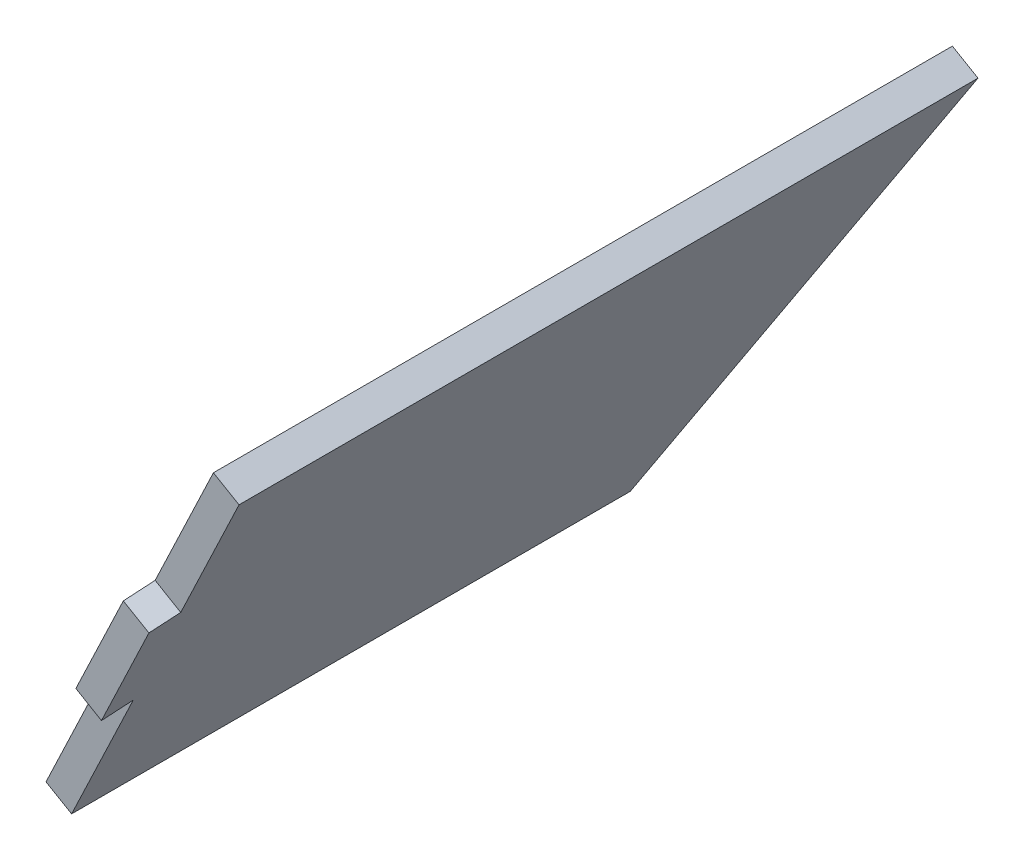
ISO-10303-21;
HEADER;
FILE_DESCRIPTION(('STEP AP214'),'2;1');
FILE_NAME('part.step','',(''),(''),'','','');
FILE_SCHEMA(('AUTOMOTIVE_DESIGN { 1 0 10303 214 1 1 1 1 }'));
ENDSEC;
DATA;
#1=APPLICATION_CONTEXT('core data for automotive mechanical design processes');
#2=APPLICATION_PROTOCOL_DEFINITION('international standard','automotive_design',2000,#1);
#3=PRODUCT_CONTEXT('',#1,'mechanical');
#4=PRODUCT('Part','Part','',(#3));
#5=PRODUCT_RELATED_PRODUCT_CATEGORY('part','',(#4));
#6=PRODUCT_DEFINITION_FORMATION('','',#4);
#7=PRODUCT_DEFINITION_CONTEXT('part definition',#1,'design');
#8=PRODUCT_DEFINITION('design','',#6,#7);
#9=PRODUCT_DEFINITION_SHAPE('','',#8);
#10=(LENGTH_UNIT() NAMED_UNIT(*) SI_UNIT(.MILLI.,.METRE.));
#11=(NAMED_UNIT(*) PLANE_ANGLE_UNIT() SI_UNIT($,.RADIAN.));
#12=(NAMED_UNIT(*) SI_UNIT($,.STERADIAN.) SOLID_ANGLE_UNIT());
#13=UNCERTAINTY_MEASURE_WITH_UNIT(LENGTH_MEASURE(1.E-05),#10,'distance_accuracy_value','');
#14=(GEOMETRIC_REPRESENTATION_CONTEXT(3) GLOBAL_UNCERTAINTY_ASSIGNED_CONTEXT((#13)) GLOBAL_UNIT_ASSIGNED_CONTEXT((#10,
#11,#12)) REPRESENTATION_CONTEXT('',''));
#15=CARTESIAN_POINT('',(0.,0.,0.));
#16=DIRECTION('',(0.,0.,1.));
#17=DIRECTION('',(1.,0.,0.));
#18=AXIS2_PLACEMENT_3D('',#15,#16,#17);
#19=CARTESIAN_POINT('',(-655.979093207312,-85.2202453071139,0.));
#20=DIRECTION('',(-0.503871025524086,-0.863778900898433,0.));
#21=DIRECTION('',(0.863778900898433,-0.503871025524086,0.));
#22=AXIS2_PLACEMENT_3D('',#19,#20,#21);
#23=PLANE('',#22);
#24=DIRECTION('',(0.,0.,1.));
#25=VECTOR('',#24,1.);
#26=CARTESIAN_POINT('',(-660.4,-82.6413830113791,0.));
#27=LINE('',#26,#25);
#28=CARTESIAN_POINT('',(-660.4,-82.6413830113788,-50.8));
#29=VERTEX_POINT('',#28);
#30=CARTESIAN_POINT('',(-660.4,-82.6413830113791,45.6029202790707));
#31=VERTEX_POINT('',#30);
#32=EDGE_CURVE('E131',#29,#31,#27,.T.);
#33=ORIENTED_EDGE('',*,*,#32,.F.);
#34=DIRECTION('',(-0.863778900898433,0.503871025524086,0.));
#35=VECTOR('',#34,1.);
#36=CARTESIAN_POINT('',(-655.979093207312,-85.2202453071136,-50.8));
#37=LINE('',#36,#35);
#38=CARTESIAN_POINT('',(-655.979093207312,-85.2202453071136,-50.8));
#39=VERTEX_POINT('',#38);
#40=EDGE_CURVE('E11',#39,#29,#37,.T.);
#41=ORIENTED_EDGE('',*,*,#40,.F.);
#42=DIRECTION('',(0.,0.,1.));
#43=VECTOR('',#42,1.);
#44=CARTESIAN_POINT('',(-655.979093207312,-85.2202453071139,0.));
#45=LINE('',#44,#43);
#46=CARTESIAN_POINT('',(-655.979093207312,-85.220245307114,45.6029202790707));
#47=VERTEX_POINT('',#46);
#48=EDGE_CURVE('E151',#39,#47,#45,.T.);
#49=ORIENTED_EDGE('',*,*,#48,.T.);
#50=DIRECTION('',(-0.863778900898433,0.503871025524086,0.));
#51=VECTOR('',#50,1.);
#52=CARTESIAN_POINT('',(-655.979093207312,-85.220245307114,45.6029202790707));
#53=LINE('',#52,#51);
#54=EDGE_CURVE('E38',#47,#31,#53,.T.);
#55=ORIENTED_EDGE('',*,*,#54,.T.);
#56=EDGE_LOOP('',(#33,#41,#49,#55));
#57=FACE_BOUND('',#56,.T.);
#58=ADVANCED_FACE('F35',(#57),#23,.T.);
#59=CARTESIAN_POINT('',(-462.864654077372,245.83307891564,-118.390053695479));
#60=DIRECTION('',(-0.0875097017545337,-0.150016631579201,-0.984803057645773));
#61=DIRECTION('',(0.,0.988595639399345,-0.150594361649434));
#62=AXIS2_PLACEMENT_3D('',#59,#60,#61);
#63=PLANE('',#62);
#64=DIRECTION('',(-0.496213726595231,-0.850652102734682,0.173674804308331));
#65=VECTOR('',#64,1.);
#66=CARTESIAN_POINT('',(-467.28556087006,248.411941211375,-118.390053695479));
#67=LINE('',#66,#65);
#68=CARTESIAN_POINT('',(-615.95,-6.44138301137923,-66.3574999999999));
#69=VERTEX_POINT('',#68);
#70=EDGE_CURVE('E149',#69,#29,#67,.T.);
#71=ORIENTED_EDGE('',*,*,#70,.F.);
#72=DIRECTION('',(-0.863778900898433,0.503871025524086,0.));
#73=VECTOR('',#72,1.);
#74=CARTESIAN_POINT('',(-611.529093207312,-9.02024530711405,-66.3574999999999));
#75=LINE('',#74,#73);
#76=CARTESIAN_POINT('',(-611.529093207312,-9.02024530711405,-66.3574999999999));
#77=VERTEX_POINT('',#76);
#78=EDGE_CURVE('E44',#77,#69,#75,.T.);
#79=ORIENTED_EDGE('',*,*,#78,.F.);
#80=DIRECTION('',(-0.496213726595231,-0.850652102734682,0.173674804308331));
#81=VECTOR('',#80,1.);
#82=CARTESIAN_POINT('',(-462.864654077372,245.83307891564,-118.390053695479));
#83=LINE('',#82,#81);
#84=EDGE_CURVE('E120',#77,#39,#83,.T.);
#85=ORIENTED_EDGE('',*,*,#84,.T.);
#86=ORIENTED_EDGE('',*,*,#40,.T.);
#87=EDGE_LOOP('',(#71,#79,#85,#86));
#88=FACE_BOUND('',#87,.T.);
#89=ADVANCED_FACE('F163',(#88),#63,.T.);
#90=CARTESIAN_POINT('',(-611.529093207312,-9.02024530711397,0.));
#91=DIRECTION('',(0.503871025524086,0.863778900898433,0.));
#92=DIRECTION('',(-0.863778900898433,0.503871025524086,0.));
#93=AXIS2_PLACEMENT_3D('',#90,#91,#92);
#94=PLANE('',#93);
#95=DIRECTION('',(0.,0.,-1.));
#96=VECTOR('',#95,1.);
#97=CARTESIAN_POINT('',(-615.95,-6.44138301137914,0.));
#98=LINE('',#97,#96);
#99=CARTESIAN_POINT('',(-615.95,-6.4413830113792,61.1604202790707));
#100=VERTEX_POINT('',#99);
#101=EDGE_CURVE('E109',#100,#69,#98,.T.);
#102=ORIENTED_EDGE('',*,*,#101,.F.);
#103=DIRECTION('',(-0.863778900898433,0.503871025524086,0.));
#104=VECTOR('',#103,1.);
#105=CARTESIAN_POINT('',(-611.529093207312,-9.02024530711402,61.1604202790707));
#106=LINE('',#105,#104);
#107=CARTESIAN_POINT('',(-611.529093207312,-9.02024530711402,61.1604202790707));
#108=VERTEX_POINT('',#107);
#109=EDGE_CURVE('E104',#108,#100,#106,.T.);
#110=ORIENTED_EDGE('',*,*,#109,.F.);
#111=DIRECTION('',(0.,0.,-1.));
#112=VECTOR('',#111,1.);
#113=CARTESIAN_POINT('',(-611.529093207312,-9.02024530711397,0.));
#114=LINE('',#113,#112);
#115=EDGE_CURVE('E107',#108,#77,#114,.T.);
#116=ORIENTED_EDGE('',*,*,#115,.T.);
#117=ORIENTED_EDGE('',*,*,#78,.T.);
#118=EDGE_LOOP('',(#102,#110,#116,#117));
#119=FACE_BOUND('',#118,.T.);
#120=ADVANCED_FACE('F106',(#119),#94,.T.);
#121=CARTESIAN_POINT('',(-462.416770672822,246.600879037726,113.349733166142));
#122=DIRECTION('',(-0.0875097017545336,-0.1500166315792,0.984803057645773));
#123=DIRECTION('',(0.,-0.988595639399345,-0.150594361649434));
#124=AXIS2_PLACEMENT_3D('',#121,#122,#123);
#125=PLANE('',#124);
#126=DIRECTION('',(0.496213726595231,0.850652102734682,0.173674804308331));
#127=VECTOR('',#126,1.);
#128=CARTESIAN_POINT('',(-466.83767746551,249.17974133346,113.349733166142));
#129=LINE('',#128,#127);
#130=CARTESIAN_POINT('',(-631.425202267691,-32.9703011845631,55.744099485379));
#131=VERTEX_POINT('',#130);
#132=EDGE_CURVE('E146',#131,#100,#129,.T.);
#133=ORIENTED_EDGE('',*,*,#132,.F.);
#134=DIRECTION('',(-0.863778900898433,0.503871025524086,0.));
#135=VECTOR('',#134,1.);
#136=CARTESIAN_POINT('',(-627.004295475003,-35.549163480298,55.744099485379));
#137=LINE('',#136,#135);
#138=CARTESIAN_POINT('',(-627.004295475003,-35.549163480298,55.744099485379));
#139=VERTEX_POINT('',#138);
#140=EDGE_CURVE('E114',#139,#131,#137,.T.);
#141=ORIENTED_EDGE('',*,*,#140,.F.);
#142=DIRECTION('',(0.496213726595231,0.850652102734682,0.173674804308331));
#143=VECTOR('',#142,1.);
#144=CARTESIAN_POINT('',(-462.416770672822,246.600879037726,113.349733166142));
#145=LINE('',#144,#143);
#146=EDGE_CURVE('E119',#139,#108,#145,.T.);
#147=ORIENTED_EDGE('',*,*,#146,.T.);
#148=ORIENTED_EDGE('',*,*,#109,.T.);
#149=EDGE_LOOP('',(#133,#141,#147,#148));
#150=FACE_BOUND('',#149,.T.);
#151=ADVANCED_FACE('F122',(#150),#125,.T.);
#152=CARTESIAN_POINT('',(-616.932026439773,-18.2824165627608,-57.6056336807641));
#153=DIRECTION('',(-0.496213726595231,-0.850652102734682,-0.173674804308334));
#154=DIRECTION('',(0.863778900898433,-0.503871025524086,0.));
#155=AXIS2_PLACEMENT_3D('',#152,#153,#154);
#156=PLANE('',#155);
#157=DIRECTION('',(-0.0875097017545352,-0.150016631579203,0.984803057645772));
#158=VECTOR('',#157,1.);
#159=CARTESIAN_POINT('',(-621.352933232461,-15.703554267026,-57.6056336807641));
#160=LINE('',#159,#158);
#161=CARTESIAN_POINT('',(-631.873085672241,-33.7381013066486,60.7844200147158));
#162=VERTEX_POINT('',#161);
#163=EDGE_CURVE('E143',#131,#162,#160,.T.);
#164=ORIENTED_EDGE('',*,*,#163,.T.);
#165=DIRECTION('',(-0.863778900898433,0.503871025524086,0.));
#166=VECTOR('',#165,1.);
#167=CARTESIAN_POINT('',(-627.452178879553,-36.3169636023834,60.7844200147158));
#168=LINE('',#167,#166);
#169=CARTESIAN_POINT('',(-627.452178879553,-36.3169636023834,60.7844200147158));
#170=VERTEX_POINT('',#169);
#171=EDGE_CURVE('E155',#170,#162,#168,.T.);
#172=ORIENTED_EDGE('',*,*,#171,.F.);
#173=DIRECTION('',(-0.0875097017545352,-0.150016631579203,0.984803057645772));
#174=VECTOR('',#173,1.);
#175=CARTESIAN_POINT('',(-616.932026439773,-18.2824165627608,-57.6056336807641));
#176=LINE('',#175,#174);
#177=EDGE_CURVE('E124',#139,#170,#176,.T.);
#178=ORIENTED_EDGE('',*,*,#177,.F.);
#179=ORIENTED_EDGE('',*,*,#140,.T.);
#180=EDGE_LOOP('',(#164,#172,#178,#179));
#181=FACE_BOUND('',#180,.T.);
#182=ADVANCED_FACE('F176',(#181),#156,.F.);
#183=CARTESIAN_POINT('',(-462.864654077372,245.83307891564,118.390053695479));
#184=DIRECTION('',(-0.0875097017545337,-0.150016631579201,0.984803057645773));
#185=DIRECTION('',(0.,-0.988595639399345,-0.150594361649434));
#186=AXIS2_PLACEMENT_3D('',#183,#184,#185);
#187=PLANE('',#186);
#188=DIRECTION('',(0.496213726595231,0.850652102734682,0.173674804308331));
#189=VECTOR('',#188,1.);
#190=CARTESIAN_POINT('',(-467.28556087006,248.411941211375,118.390053695479));
#191=LINE('',#190,#189);
#192=CARTESIAN_POINT('',(-644.47691432776,-55.3446647161094,56.3730799852842));
#193=VERTEX_POINT('',#192);
#194=EDGE_CURVE('E140',#193,#162,#191,.T.);
#195=ORIENTED_EDGE('',*,*,#194,.F.);
#196=DIRECTION('',(-0.863778900898433,0.503871025524086,0.));
#197=VECTOR('',#196,1.);
#198=CARTESIAN_POINT('',(-640.056007535071,-57.9235270118443,56.3730799852842));
#199=LINE('',#198,#197);
#200=CARTESIAN_POINT('',(-640.056007535071,-57.9235270118443,56.3730799852842));
#201=VERTEX_POINT('',#200);
#202=EDGE_CURVE('E157',#201,#193,#199,.T.);
#203=ORIENTED_EDGE('',*,*,#202,.F.);
#204=DIRECTION('',(0.496213726595231,0.850652102734682,0.173674804308331));
#205=VECTOR('',#204,1.);
#206=CARTESIAN_POINT('',(-462.864654077372,245.83307891564,118.390053695479));
#207=LINE('',#206,#205);
#208=EDGE_CURVE('E126',#201,#170,#207,.T.);
#209=ORIENTED_EDGE('',*,*,#208,.T.);
#210=ORIENTED_EDGE('',*,*,#171,.T.);
#211=EDGE_LOOP('',(#195,#203,#209,#210));
#212=FACE_BOUND('',#211,.T.);
#213=ADVANCED_FACE('F179',(#212),#187,.T.);
#214=CARTESIAN_POINT('',(-629.535855095291,-39.8889799722217,-62.0169737101957));
#215=DIRECTION('',(-0.496213726595231,-0.850652102734682,-0.173674804308333));
#216=DIRECTION('',(0.863778900898433,-0.503871025524086,0.));
#217=AXIS2_PLACEMENT_3D('',#214,#215,#216);
#218=PLANE('',#217);
#219=DIRECTION('',(-0.0875097017545351,-0.150016631579203,0.984803057645772));
#220=VECTOR('',#219,1.);
#221=CARTESIAN_POINT('',(-633.95676188798,-37.3101176764869,-62.0169737101957));
#222=LINE('',#221,#220);
#223=CARTESIAN_POINT('',(-644.02903092321,-54.5768645940241,51.3327594559474));
#224=VERTEX_POINT('',#223);
#225=EDGE_CURVE('E137',#224,#193,#222,.T.);
#226=ORIENTED_EDGE('',*,*,#225,.F.);
#227=DIRECTION('',(-0.863778900898433,0.503871025524086,0.));
#228=VECTOR('',#227,1.);
#229=CARTESIAN_POINT('',(-639.608124130522,-57.1557268897589,51.3327594559474));
#230=LINE('',#229,#228);
#231=CARTESIAN_POINT('',(-639.608124130522,-57.1557268897589,51.3327594559474));
#232=VERTEX_POINT('',#231);
#233=EDGE_CURVE('E158',#232,#224,#230,.T.);
#234=ORIENTED_EDGE('',*,*,#233,.F.);
#235=DIRECTION('',(-0.0875097017545351,-0.150016631579203,0.984803057645772));
#236=VECTOR('',#235,1.);
#237=CARTESIAN_POINT('',(-629.535855095291,-39.8889799722217,-62.0169737101957));
#238=LINE('',#237,#236);
#239=EDGE_CURVE('E303',#232,#201,#238,.T.);
#240=ORIENTED_EDGE('',*,*,#239,.T.);
#241=ORIENTED_EDGE('',*,*,#202,.T.);
#242=EDGE_LOOP('',(#226,#234,#240,#241));
#243=FACE_BOUND('',#242,.T.);
#244=ADVANCED_FACE('F183',(#243),#218,.T.);
#245=CARTESIAN_POINT('',(-462.416770672822,246.600879037726,113.349733166142));
#246=DIRECTION('',(-0.0875097017545336,-0.1500166315792,0.984803057645773));
#247=DIRECTION('',(0.,-0.988595639399345,-0.150594361649434));
#248=AXIS2_PLACEMENT_3D('',#245,#246,#247);
#249=PLANE('',#248);
#250=DIRECTION('',(0.496213726595231,0.850652102734682,0.173674804308331));
#251=VECTOR('',#250,1.);
#252=CARTESIAN_POINT('',(-466.83767746551,249.17974133346,113.349733166142));
#253=LINE('',#252,#251);
#254=EDGE_CURVE('E134',#31,#224,#253,.T.);
#255=ORIENTED_EDGE('',*,*,#254,.F.);
#256=ORIENTED_EDGE('',*,*,#54,.F.);
#257=DIRECTION('',(0.496213726595231,0.850652102734682,0.173674804308331));
#258=VECTOR('',#257,1.);
#259=CARTESIAN_POINT('',(-462.416770672822,246.600879037726,113.349733166142));
#260=LINE('',#259,#258);
#261=EDGE_CURVE('E304',#47,#232,#260,.T.);
#262=ORIENTED_EDGE('',*,*,#261,.T.);
#263=ORIENTED_EDGE('',*,*,#233,.T.);
#264=EDGE_LOOP('',(#255,#256,#262,#263));
#265=FACE_BOUND('',#264,.T.);
#266=ADVANCED_FACE('F160',(#265),#249,.T.);
#267=CARTESIAN_POINT('',(-452.344501637592,263.867625955262,0.));
#268=DIRECTION('',(-0.863778900898433,0.503871025524086,0.));
#269=DIRECTION('',(-0.503871025524086,-0.863778900898433,0.));
#270=AXIS2_PLACEMENT_3D('',#267,#268,#269);
#271=PLANE('',#270);
#272=ORIENTED_EDGE('',*,*,#48,.F.);
#273=ORIENTED_EDGE('',*,*,#84,.F.);
#274=ORIENTED_EDGE('',*,*,#115,.F.);
#275=ORIENTED_EDGE('',*,*,#146,.F.);
#276=ORIENTED_EDGE('',*,*,#177,.T.);
#277=ORIENTED_EDGE('',*,*,#208,.F.);
#278=ORIENTED_EDGE('',*,*,#239,.F.);
#279=ORIENTED_EDGE('',*,*,#261,.F.);
#280=EDGE_LOOP('',(#272,#273,#274,#275,#276,#277,#278,#279));
#281=FACE_BOUND('',#280,.T.);
#282=ADVANCED_FACE('F118',(#281),#271,.F.);
#283=CARTESIAN_POINT('',(-456.765408430281,266.446488250997,0.));
#284=DIRECTION('',(-0.863778900898433,0.503871025524086,0.));
#285=DIRECTION('',(-0.503871025524086,-0.863778900898433,0.));
#286=AXIS2_PLACEMENT_3D('',#283,#284,#285);
#287=PLANE('',#286);
#288=ORIENTED_EDGE('',*,*,#32,.T.);
#289=ORIENTED_EDGE('',*,*,#254,.T.);
#290=ORIENTED_EDGE('',*,*,#225,.T.);
#291=ORIENTED_EDGE('',*,*,#194,.T.);
#292=ORIENTED_EDGE('',*,*,#163,.F.);
#293=ORIENTED_EDGE('',*,*,#132,.T.);
#294=ORIENTED_EDGE('',*,*,#101,.T.);
#295=ORIENTED_EDGE('',*,*,#70,.T.);
#296=EDGE_LOOP('',(#288,#289,#290,#291,#292,#293,#294,#295));
#297=FACE_BOUND('',#296,.T.);
#298=ADVANCED_FACE('F162',(#297),#287,.T.);
#299=CLOSED_SHELL('',(#58,#89,#120,#151,#182,#213,#244,#266,#282,#298));
#300=MANIFOLD_SOLID_BREP('B2',#299);
#301=ADVANCED_BREP_SHAPE_REPRESENTATION('',(#18,#300),#14);
#302=SHAPE_DEFINITION_REPRESENTATION(#9,#301);
ENDSEC;
END-ISO-10303-21;
